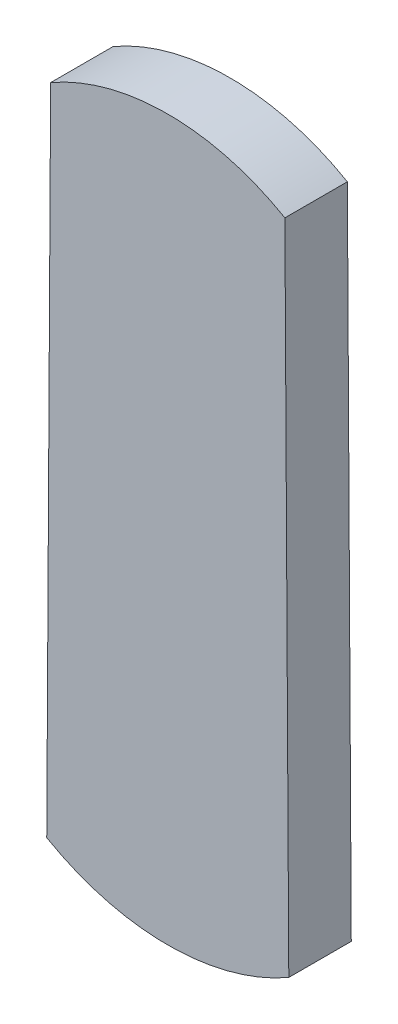
ISO-10303-21;
HEADER;
FILE_DESCRIPTION(('STEP AP214'),'2;1');
FILE_NAME('part.step','',(''),(''),'','','');
FILE_SCHEMA(('AUTOMOTIVE_DESIGN { 1 0 10303 214 1 1 1 1 }'));
ENDSEC;
DATA;
#1=APPLICATION_CONTEXT('core data for automotive mechanical design processes');
#2=APPLICATION_PROTOCOL_DEFINITION('international standard','automotive_design',2000,#1);
#3=PRODUCT_CONTEXT('',#1,'mechanical');
#4=PRODUCT('Part','Part','',(#3));
#5=PRODUCT_RELATED_PRODUCT_CATEGORY('part','',(#4));
#6=PRODUCT_DEFINITION_FORMATION('','',#4);
#7=PRODUCT_DEFINITION_CONTEXT('part definition',#1,'design');
#8=PRODUCT_DEFINITION('design','',#6,#7);
#9=PRODUCT_DEFINITION_SHAPE('','',#8);
#10=(LENGTH_UNIT() NAMED_UNIT(*) SI_UNIT(.MILLI.,.METRE.));
#11=(NAMED_UNIT(*) PLANE_ANGLE_UNIT() SI_UNIT($,.RADIAN.));
#12=(NAMED_UNIT(*) SI_UNIT($,.STERADIAN.) SOLID_ANGLE_UNIT());
#13=UNCERTAINTY_MEASURE_WITH_UNIT(LENGTH_MEASURE(1.E-05),#10,'distance_accuracy_value','');
#14=(GEOMETRIC_REPRESENTATION_CONTEXT(3) GLOBAL_UNCERTAINTY_ASSIGNED_CONTEXT((#13)) GLOBAL_UNIT_ASSIGNED_CONTEXT((#10,
#11,#12)) REPRESENTATION_CONTEXT('',''));
#15=CARTESIAN_POINT('',(0.,0.,0.));
#16=DIRECTION('',(0.,0.,1.));
#17=DIRECTION('',(1.,0.,0.));
#18=AXIS2_PLACEMENT_3D('',#15,#16,#17);
#19=CARTESIAN_POINT('',(0.,-30.,8.));
#20=DIRECTION('',(0.,0.,-1.));
#21=DIRECTION('',(-1.,0.,0.));
#22=AXIS2_PLACEMENT_3D('',#19,#20,#21);
#23=CYLINDRICAL_SURFACE('',#22,30.);
#24=CARTESIAN_POINT('',(0.,-30.,0.));
#25=DIRECTION('',(0.,0.,1.));
#26=DIRECTION('',(1.,0.,0.));
#27=AXIS2_PLACEMENT_3D('',#24,#25,#26);
#28=CIRCLE('',#27,30.);
#29=CARTESIAN_POINT('',(15.,-4.01923788646684,0.));
#30=VERTEX_POINT('',#29);
#31=CARTESIAN_POINT('',(-15.,-4.01923788646684,0.));
#32=VERTEX_POINT('',#31);
#33=EDGE_CURVE('E100',#30,#32,#28,.T.);
#34=ORIENTED_EDGE('',*,*,#33,.T.);
#35=DIRECTION('',(0.,0.,-1.));
#36=VECTOR('',#35,1.);
#37=CARTESIAN_POINT('',(-15.,-4.01923788646684,8.));
#38=LINE('',#37,#36);
#39=CARTESIAN_POINT('',(-15.,-4.01923788646684,8.));
#40=VERTEX_POINT('',#39);
#41=EDGE_CURVE('E11',#40,#32,#38,.T.);
#42=ORIENTED_EDGE('',*,*,#41,.F.);
#43=CARTESIAN_POINT('',(0.,-30.,8.));
#44=DIRECTION('',(0.,0.,1.));
#45=DIRECTION('',(1.,0.,0.));
#46=AXIS2_PLACEMENT_3D('',#43,#44,#45);
#47=CIRCLE('',#46,30.);
#48=CARTESIAN_POINT('',(15.,-4.01923788646684,8.));
#49=VERTEX_POINT('',#48);
#50=EDGE_CURVE('E88',#49,#40,#47,.T.);
#51=ORIENTED_EDGE('',*,*,#50,.F.);
#52=DIRECTION('',(0.,0.,-1.));
#53=VECTOR('',#52,1.);
#54=CARTESIAN_POINT('',(15.,-4.01923788646684,8.));
#55=LINE('',#54,#53);
#56=EDGE_CURVE('E96',#49,#30,#55,.T.);
#57=ORIENTED_EDGE('',*,*,#56,.T.);
#58=EDGE_LOOP('',(#34,#42,#51,#57));
#59=FACE_BOUND('',#58,.T.);
#60=ADVANCED_FACE('F37',(#59),#23,.T.);
#61=CARTESIAN_POINT('',(-15.,-4.01923788646684,8.));
#62=DIRECTION('',(0.999982285051239,-0.00595227550625726,0.));
#63=DIRECTION('',(0.00595227550625726,0.999982285051239,0.));
#64=AXIS2_PLACEMENT_3D('',#61,#62,#63);
#65=PLANE('',#64);
#66=DIRECTION('',(-0.00595227550625726,-0.999982285051239,0.));
#67=VECTOR('',#66,1.);
#68=CARTESIAN_POINT('',(-15.,-4.01923788646684,0.));
#69=LINE('',#68,#67);
#70=CARTESIAN_POINT('',(-15.5,-88.0192378864668,0.));
#71=VERTEX_POINT('',#70);
#72=EDGE_CURVE('E92',#32,#71,#69,.T.);
#73=ORIENTED_EDGE('',*,*,#72,.T.);
#74=DIRECTION('',(0.,0.,-1.));
#75=VECTOR('',#74,1.);
#76=CARTESIAN_POINT('',(-15.5,-88.0192378864668,8.));
#77=LINE('',#76,#75);
#78=CARTESIAN_POINT('',(-15.5,-88.0192378864668,8.));
#79=VERTEX_POINT('',#78);
#80=EDGE_CURVE('E45',#79,#71,#77,.T.);
#81=ORIENTED_EDGE('',*,*,#80,.F.);
#82=DIRECTION('',(-0.00595227550625726,-0.999982285051239,0.));
#83=VECTOR('',#82,1.);
#84=CARTESIAN_POINT('',(-15.,-4.01923788646684,8.));
#85=LINE('',#84,#83);
#86=EDGE_CURVE('E83',#40,#79,#85,.T.);
#87=ORIENTED_EDGE('',*,*,#86,.F.);
#88=ORIENTED_EDGE('',*,*,#41,.T.);
#89=EDGE_LOOP('',(#73,#81,#87,#88));
#90=FACE_BOUND('',#89,.T.);
#91=ADVANCED_FACE('F91',(#90),#65,.F.);
#92=CARTESIAN_POINT('',(0.,-61.1724503691492,8.));
#93=DIRECTION('',(0.,0.,-1.));
#94=DIRECTION('',(-1.,0.,0.));
#95=AXIS2_PLACEMENT_3D('',#92,#93,#94);
#96=CYLINDRICAL_SURFACE('',#95,31.);
#97=CARTESIAN_POINT('',(0.,-61.1724503691492,0.));
#98=DIRECTION('',(0.,0.,1.));
#99=DIRECTION('',(-1.,0.,0.));
#100=AXIS2_PLACEMENT_3D('',#97,#98,#99);
#101=CIRCLE('',#100,31.);
#102=CARTESIAN_POINT('',(15.5,-88.0192378864668,0.));
#103=VERTEX_POINT('',#102);
#104=EDGE_CURVE('E70',#71,#103,#101,.T.);
#105=ORIENTED_EDGE('',*,*,#104,.T.);
#106=DIRECTION('',(0.,0.,-1.));
#107=VECTOR('',#106,1.);
#108=CARTESIAN_POINT('',(15.5,-88.0192378864668,8.));
#109=LINE('',#108,#107);
#110=CARTESIAN_POINT('',(15.5,-88.0192378864668,8.));
#111=VERTEX_POINT('',#110);
#112=EDGE_CURVE('E93',#111,#103,#109,.T.);
#113=ORIENTED_EDGE('',*,*,#112,.F.);
#114=CARTESIAN_POINT('',(0.,-61.1724503691492,8.));
#115=DIRECTION('',(0.,0.,1.));
#116=DIRECTION('',(-1.,0.,0.));
#117=AXIS2_PLACEMENT_3D('',#114,#115,#116);
#118=CIRCLE('',#117,31.);
#119=EDGE_CURVE('E86',#79,#111,#118,.T.);
#120=ORIENTED_EDGE('',*,*,#119,.F.);
#121=ORIENTED_EDGE('',*,*,#80,.T.);
#122=EDGE_LOOP('',(#105,#113,#120,#121));
#123=FACE_BOUND('',#122,.T.);
#124=ADVANCED_FACE('F94',(#123),#96,.T.);
#125=CARTESIAN_POINT('',(15.,-4.01923788646684,8.));
#126=DIRECTION('',(-0.999982285051239,-0.0059522755062575,0.));
#127=DIRECTION('',(0.0059522755062575,-0.999982285051239,0.));
#128=AXIS2_PLACEMENT_3D('',#125,#126,#127);
#129=PLANE('',#128);
#130=DIRECTION('',(-0.0059522755062575,0.999982285051239,0.));
#131=VECTOR('',#130,1.);
#132=CARTESIAN_POINT('',(15.,-4.01923788646684,0.));
#133=LINE('',#132,#131);
#134=EDGE_CURVE('E76',#103,#30,#133,.T.);
#135=ORIENTED_EDGE('',*,*,#134,.T.);
#136=ORIENTED_EDGE('',*,*,#56,.F.);
#137=DIRECTION('',(-0.0059522755062575,0.999982285051239,0.));
#138=VECTOR('',#137,1.);
#139=CARTESIAN_POINT('',(15.,-4.01923788646684,8.));
#140=LINE('',#139,#138);
#141=EDGE_CURVE('E53',#111,#49,#140,.T.);
#142=ORIENTED_EDGE('',*,*,#141,.F.);
#143=ORIENTED_EDGE('',*,*,#112,.T.);
#144=EDGE_LOOP('',(#135,#136,#142,#143));
#145=FACE_BOUND('',#144,.T.);
#146=ADVANCED_FACE('F107',(#145),#129,.F.);
#147=CARTESIAN_POINT('',(0.,-30.,8.));
#148=DIRECTION('',(0.,0.,1.));
#149=DIRECTION('',(1.,0.,0.));
#150=AXIS2_PLACEMENT_3D('',#147,#148,#149);
#151=PLANE('',#150);
#152=ORIENTED_EDGE('',*,*,#50,.T.);
#153=ORIENTED_EDGE('',*,*,#86,.T.);
#154=ORIENTED_EDGE('',*,*,#119,.T.);
#155=ORIENTED_EDGE('',*,*,#141,.T.);
#156=EDGE_LOOP('',(#152,#153,#154,#155));
#157=FACE_BOUND('',#156,.T.);
#158=ADVANCED_FACE('F84',(#157),#151,.T.);
#159=CARTESIAN_POINT('',(0.,-30.,0.));
#160=DIRECTION('',(0.,0.,1.));
#161=DIRECTION('',(1.,0.,0.));
#162=AXIS2_PLACEMENT_3D('',#159,#160,#161);
#163=PLANE('',#162);
#164=ORIENTED_EDGE('',*,*,#33,.F.);
#165=ORIENTED_EDGE('',*,*,#134,.F.);
#166=ORIENTED_EDGE('',*,*,#104,.F.);
#167=ORIENTED_EDGE('',*,*,#72,.F.);
#168=EDGE_LOOP('',(#164,#165,#166,#167));
#169=FACE_BOUND('',#168,.T.);
#170=ADVANCED_FACE('F110',(#169),#163,.F.);
#171=CLOSED_SHELL('',(#60,#91,#124,#146,#158,#170));
#172=MANIFOLD_SOLID_BREP('B2',#171);
#173=ADVANCED_BREP_SHAPE_REPRESENTATION('',(#18,#172),#14);
#174=SHAPE_DEFINITION_REPRESENTATION(#9,#173);
ENDSEC;
END-ISO-10303-21;
